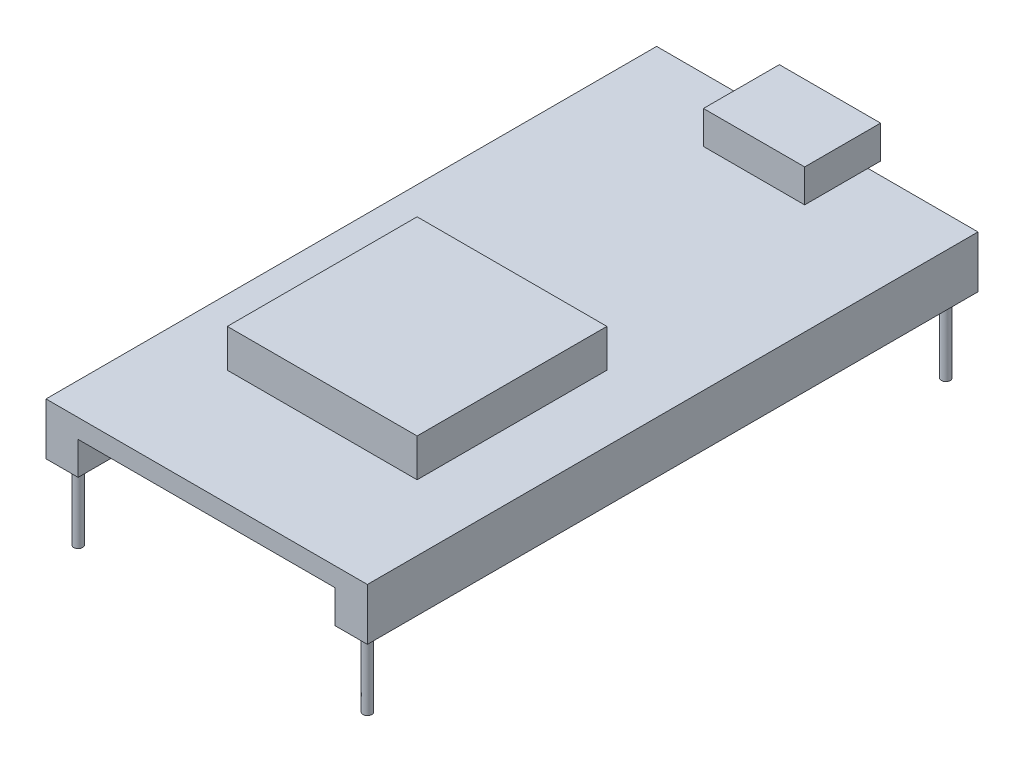
ISO-10303-21;
HEADER;
FILE_DESCRIPTION(('STEP AP214'),'2;1');
FILE_NAME('part.step','',(''),(''),'','','');
FILE_SCHEMA(('AUTOMOTIVE_DESIGN { 1 0 10303 214 1 1 1 1 }'));
ENDSEC;
DATA;
#1=APPLICATION_CONTEXT('core data for automotive mechanical design processes');
#2=APPLICATION_PROTOCOL_DEFINITION('international standard','automotive_design',2000,#1);
#3=PRODUCT_CONTEXT('',#1,'mechanical');
#4=PRODUCT('Part','Part','',(#3));
#5=PRODUCT_RELATED_PRODUCT_CATEGORY('part','',(#4));
#6=PRODUCT_DEFINITION_FORMATION('','',#4);
#7=PRODUCT_DEFINITION_CONTEXT('part definition',#1,'design');
#8=PRODUCT_DEFINITION('design','',#6,#7);
#9=PRODUCT_DEFINITION_SHAPE('','',#8);
#10=(LENGTH_UNIT() NAMED_UNIT(*) SI_UNIT(.MILLI.,.METRE.));
#11=(NAMED_UNIT(*) PLANE_ANGLE_UNIT() SI_UNIT($,.RADIAN.));
#12=(NAMED_UNIT(*) SI_UNIT($,.STERADIAN.) SOLID_ANGLE_UNIT());
#13=UNCERTAINTY_MEASURE_WITH_UNIT(LENGTH_MEASURE(1.E-05),#10,'distance_accuracy_value','');
#14=(GEOMETRIC_REPRESENTATION_CONTEXT(3) GLOBAL_UNCERTAINTY_ASSIGNED_CONTEXT((#13)) GLOBAL_UNIT_ASSIGNED_CONTEXT((#10,
#11,#12)) REPRESENTATION_CONTEXT('',''));
#15=CARTESIAN_POINT('',(0.,0.,0.));
#16=DIRECTION('',(0.,0.,1.));
#17=DIRECTION('',(1.,0.,0.));
#18=AXIS2_PLACEMENT_3D('',#15,#16,#17);
#19=CARTESIAN_POINT('',(0.,0.,0.));
#20=DIRECTION('',(0.,-1.,0.));
#21=DIRECTION('',(0.,0.,-1.));
#22=AXIS2_PLACEMENT_3D('',#19,#20,#21);
#23=PLANE('',#22);
#24=DIRECTION('',(-1.,0.,0.));
#25=VECTOR('',#24,1.);
#26=CARTESIAN_POINT('',(-12.7,0.,-24.13));
#27=LINE('',#26,#25);
#28=CARTESIAN_POINT('',(10.16,0.,-24.13));
#29=VERTEX_POINT('',#28);
#30=CARTESIAN_POINT('',(-10.16,0.,-24.13));
#31=VERTEX_POINT('',#30);
#32=EDGE_CURVE('E53',#29,#31,#27,.T.);
#33=ORIENTED_EDGE('',*,*,#32,.F.);
#34=DIRECTION('',(0.,0.,-1.));
#35=VECTOR('',#34,1.);
#36=CARTESIAN_POINT('',(10.16,0.,24.13));
#37=LINE('',#36,#35);
#38=CARTESIAN_POINT('',(10.16,0.,24.13));
#39=VERTEX_POINT('',#38);
#40=EDGE_CURVE('E178',#39,#29,#37,.T.);
#41=ORIENTED_EDGE('',*,*,#40,.F.);
#42=DIRECTION('',(1.,0.,0.));
#43=VECTOR('',#42,1.);
#44=CARTESIAN_POINT('',(-12.7,0.,24.13));
#45=LINE('',#44,#43);
#46=CARTESIAN_POINT('',(-10.16,0.,24.13));
#47=VERTEX_POINT('',#46);
#48=EDGE_CURVE('E277',#47,#39,#45,.T.);
#49=ORIENTED_EDGE('',*,*,#48,.F.);
#50=DIRECTION('',(0.,0.,1.));
#51=VECTOR('',#50,1.);
#52=CARTESIAN_POINT('',(-10.16,0.,-24.13));
#53=LINE('',#52,#51);
#54=EDGE_CURVE('E189',#31,#47,#53,.T.);
#55=ORIENTED_EDGE('',*,*,#54,.F.);
#56=EDGE_LOOP('',(#33,#41,#49,#55));
#57=FACE_BOUND('',#56,.T.);
#58=ADVANCED_FACE('F33',(#57),#23,.T.);
#59=CARTESIAN_POINT('',(0.,1.5,0.));
#60=DIRECTION('',(0.,-1.,0.));
#61=DIRECTION('',(0.,0.,-1.));
#62=AXIS2_PLACEMENT_3D('',#59,#60,#61);
#63=PLANE('',#62);
#64=DIRECTION('',(0.,0.,-1.));
#65=VECTOR('',#64,1.);
#66=CARTESIAN_POINT('',(7.50000000000001,1.5,15.));
#67=LINE('',#66,#65);
#68=CARTESIAN_POINT('',(7.50000000000001,1.5,15.));
#69=VERTEX_POINT('',#68);
#70=CARTESIAN_POINT('',(7.5,1.5,0.));
#71=VERTEX_POINT('',#70);
#72=EDGE_CURVE('E242',#69,#71,#67,.T.);
#73=ORIENTED_EDGE('',*,*,#72,.F.);
#74=DIRECTION('',(1.,0.,0.));
#75=VECTOR('',#74,1.);
#76=CARTESIAN_POINT('',(-7.49999999999999,1.5,15.));
#77=LINE('',#76,#75);
#78=CARTESIAN_POINT('',(-7.49999999999999,1.5,15.));
#79=VERTEX_POINT('',#78);
#80=EDGE_CURVE('E247',#79,#69,#77,.T.);
#81=ORIENTED_EDGE('',*,*,#80,.F.);
#82=DIRECTION('',(0.,0.,1.));
#83=VECTOR('',#82,1.);
#84=CARTESIAN_POINT('',(-7.49999999999999,1.5,15.));
#85=LINE('',#84,#83);
#86=CARTESIAN_POINT('',(-7.5,1.5,0.));
#87=VERTEX_POINT('',#86);
#88=EDGE_CURVE('E259',#87,#79,#85,.T.);
#89=ORIENTED_EDGE('',*,*,#88,.F.);
#90=DIRECTION('',(-1.,0.,0.));
#91=VECTOR('',#90,1.);
#92=CARTESIAN_POINT('',(-7.5,1.5,0.));
#93=LINE('',#92,#91);
#94=EDGE_CURVE('E256',#71,#87,#93,.T.);
#95=ORIENTED_EDGE('',*,*,#94,.F.);
#96=EDGE_LOOP('',(#73,#81,#89,#95));
#97=FACE_BOUND('',#96,.T.);
#98=DIRECTION('',(0.,0.,-1.));
#99=VECTOR('',#98,1.);
#100=CARTESIAN_POINT('',(4.,1.5,-19.13));
#101=LINE('',#100,#99);
#102=CARTESIAN_POINT('',(4.,1.5,-19.13));
#103=VERTEX_POINT('',#102);
#104=CARTESIAN_POINT('',(3.99999999999999,1.5,-24.13));
#105=VERTEX_POINT('',#104);
#106=EDGE_CURVE('E220',#103,#105,#101,.T.);
#107=ORIENTED_EDGE('',*,*,#106,.F.);
#108=DIRECTION('',(1.,0.,0.));
#109=VECTOR('',#108,1.);
#110=CARTESIAN_POINT('',(-4.,1.5,-19.13));
#111=LINE('',#110,#109);
#112=CARTESIAN_POINT('',(-4.,1.5,-19.13));
#113=VERTEX_POINT('',#112);
#114=EDGE_CURVE('E213',#113,#103,#111,.T.);
#115=ORIENTED_EDGE('',*,*,#114,.F.);
#116=DIRECTION('',(0.,0.,1.));
#117=VECTOR('',#116,1.);
#118=CARTESIAN_POINT('',(-4.,1.5,-19.13));
#119=LINE('',#118,#117);
#120=CARTESIAN_POINT('',(-4.,1.5,-24.13));
#121=VERTEX_POINT('',#120);
#122=EDGE_CURVE('E225',#121,#113,#119,.T.);
#123=ORIENTED_EDGE('',*,*,#122,.F.);
#124=DIRECTION('',(-1.,0.,0.));
#125=VECTOR('',#124,1.);
#126=CARTESIAN_POINT('',(-12.7,1.5,-24.13));
#127=LINE('',#126,#125);
#128=CARTESIAN_POINT('',(-12.7,1.5,-24.13));
#129=VERTEX_POINT('',#128);
#130=EDGE_CURVE('E276',#121,#129,#127,.T.);
#131=ORIENTED_EDGE('',*,*,#130,.T.);
#132=DIRECTION('',(0.,0.,1.));
#133=VECTOR('',#132,1.);
#134=CARTESIAN_POINT('',(-12.7,1.5,24.13));
#135=LINE('',#134,#133);
#136=CARTESIAN_POINT('',(-12.7,1.5,24.13));
#137=VERTEX_POINT('',#136);
#138=EDGE_CURVE('E281',#129,#137,#135,.T.);
#139=ORIENTED_EDGE('',*,*,#138,.T.);
#140=DIRECTION('',(1.,0.,0.));
#141=VECTOR('',#140,1.);
#142=CARTESIAN_POINT('',(-12.7,1.5,24.13));
#143=LINE('',#142,#141);
#144=CARTESIAN_POINT('',(12.7,1.5,24.13));
#145=VERTEX_POINT('',#144);
#146=EDGE_CURVE('E164',#137,#145,#143,.T.);
#147=ORIENTED_EDGE('',*,*,#146,.T.);
#148=DIRECTION('',(0.,0.,-1.));
#149=VECTOR('',#148,1.);
#150=CARTESIAN_POINT('',(12.7,1.5,24.13));
#151=LINE('',#150,#149);
#152=CARTESIAN_POINT('',(12.7,1.5,-24.13));
#153=VERTEX_POINT('',#152);
#154=EDGE_CURVE('E160',#145,#153,#151,.T.);
#155=ORIENTED_EDGE('',*,*,#154,.T.);
#156=EDGE_CURVE('E278',#153,#105,#127,.T.);
#157=ORIENTED_EDGE('',*,*,#156,.T.);
#158=EDGE_LOOP('',(#107,#115,#123,#131,#139,#147,#155,#157));
#159=FACE_BOUND('',#158,.T.);
#160=ADVANCED_FACE('F323',(#97,#159),#63,.F.);
#161=CARTESIAN_POINT('',(12.7,1.5,24.13));
#162=DIRECTION('',(-1.,0.,0.));
#163=DIRECTION('',(0.,0.,1.));
#164=AXIS2_PLACEMENT_3D('',#161,#162,#163);
#165=PLANE('',#164);
#166=DIRECTION('',(0.,-1.,0.));
#167=VECTOR('',#166,1.);
#168=CARTESIAN_POINT('',(12.7,1.5,24.13));
#169=LINE('',#168,#167);
#170=CARTESIAN_POINT('',(12.7,-2.6,24.13));
#171=VERTEX_POINT('',#170);
#172=EDGE_CURVE('E154',#145,#171,#169,.T.);
#173=ORIENTED_EDGE('',*,*,#172,.T.);
#174=DIRECTION('',(0.,0.,1.));
#175=VECTOR('',#174,1.);
#176=CARTESIAN_POINT('',(12.7,-2.6,24.13));
#177=LINE('',#176,#175);
#178=CARTESIAN_POINT('',(12.7,-2.6,-24.13));
#179=VERTEX_POINT('',#178);
#180=EDGE_CURVE('E158',#179,#171,#177,.T.);
#181=ORIENTED_EDGE('',*,*,#180,.F.);
#182=DIRECTION('',(0.,-1.,0.));
#183=VECTOR('',#182,1.);
#184=CARTESIAN_POINT('',(12.7,1.5,-24.13));
#185=LINE('',#184,#183);
#186=EDGE_CURVE('E290',#153,#179,#185,.T.);
#187=ORIENTED_EDGE('',*,*,#186,.F.);
#188=ORIENTED_EDGE('',*,*,#154,.F.);
#189=EDGE_LOOP('',(#173,#181,#187,#188));
#190=FACE_BOUND('',#189,.T.);
#191=ADVANCED_FACE('F35',(#190),#165,.F.);
#192=CARTESIAN_POINT('',(-12.7,1.5,-24.13));
#193=DIRECTION('',(0.,0.,1.));
#194=DIRECTION('',(1.,0.,0.));
#195=AXIS2_PLACEMENT_3D('',#192,#193,#194);
#196=PLANE('',#195);
#197=ORIENTED_EDGE('',*,*,#186,.T.);
#198=DIRECTION('',(1.,0.,0.));
#199=VECTOR('',#198,1.);
#200=CARTESIAN_POINT('',(12.7,-2.6,-24.13));
#201=LINE('',#200,#199);
#202=CARTESIAN_POINT('',(10.16,-2.6,-24.13));
#203=VERTEX_POINT('',#202);
#204=EDGE_CURVE('E177',#203,#179,#201,.T.);
#205=ORIENTED_EDGE('',*,*,#204,.F.);
#206=DIRECTION('',(0.,1.,0.));
#207=VECTOR('',#206,1.);
#208=CARTESIAN_POINT('',(10.16,-2.6,-24.13));
#209=LINE('',#208,#207);
#210=EDGE_CURVE('E48',#203,#29,#209,.T.);
#211=ORIENTED_EDGE('',*,*,#210,.T.);
#212=ORIENTED_EDGE('',*,*,#32,.T.);
#213=DIRECTION('',(0.,1.,0.));
#214=VECTOR('',#213,1.);
#215=CARTESIAN_POINT('',(-10.16,-2.6,-24.13));
#216=LINE('',#215,#214);
#217=CARTESIAN_POINT('',(-10.16,-2.6,-24.13));
#218=VERTEX_POINT('',#217);
#219=EDGE_CURVE('E205',#218,#31,#216,.T.);
#220=ORIENTED_EDGE('',*,*,#219,.F.);
#221=DIRECTION('',(1.,0.,0.));
#222=VECTOR('',#221,1.);
#223=CARTESIAN_POINT('',(-12.7,-2.6,-24.13));
#224=LINE('',#223,#222);
#225=CARTESIAN_POINT('',(-12.7,-2.6,-24.13));
#226=VERTEX_POINT('',#225);
#227=EDGE_CURVE('E193',#226,#218,#224,.T.);
#228=ORIENTED_EDGE('',*,*,#227,.F.);
#229=DIRECTION('',(0.,-1.,0.));
#230=VECTOR('',#229,1.);
#231=CARTESIAN_POINT('',(-12.7,1.5,-24.13));
#232=LINE('',#231,#230);
#233=EDGE_CURVE('E288',#129,#226,#232,.T.);
#234=ORIENTED_EDGE('',*,*,#233,.F.);
#235=ORIENTED_EDGE('',*,*,#130,.F.);
#236=EDGE_CURVE('E282',#105,#121,#127,.T.);
#237=ORIENTED_EDGE('',*,*,#236,.F.);
#238=ORIENTED_EDGE('',*,*,#156,.F.);
#239=EDGE_LOOP('',(#197,#205,#211,#212,#220,#228,#234,#235,#237,#238));
#240=FACE_BOUND('',#239,.T.);
#241=ADVANCED_FACE('F318',(#240),#196,.F.);
#242=CARTESIAN_POINT('',(-12.7,1.5,24.13));
#243=DIRECTION('',(1.,0.,0.));
#244=DIRECTION('',(0.,0.,-1.));
#245=AXIS2_PLACEMENT_3D('',#242,#243,#244);
#246=PLANE('',#245);
#247=ORIENTED_EDGE('',*,*,#233,.T.);
#248=DIRECTION('',(0.,0.,-1.));
#249=VECTOR('',#248,1.);
#250=CARTESIAN_POINT('',(-12.7,-2.6,-24.13));
#251=LINE('',#250,#249);
#252=CARTESIAN_POINT('',(-12.7,-2.6,24.13));
#253=VERTEX_POINT('',#252);
#254=EDGE_CURVE('E190',#253,#226,#251,.T.);
#255=ORIENTED_EDGE('',*,*,#254,.F.);
#256=DIRECTION('',(0.,-1.,0.));
#257=VECTOR('',#256,1.);
#258=CARTESIAN_POINT('',(-12.7,1.5,24.13));
#259=LINE('',#258,#257);
#260=EDGE_CURVE('E163',#137,#253,#259,.T.);
#261=ORIENTED_EDGE('',*,*,#260,.F.);
#262=ORIENTED_EDGE('',*,*,#138,.F.);
#263=EDGE_LOOP('',(#247,#255,#261,#262));
#264=FACE_BOUND('',#263,.T.);
#265=ADVANCED_FACE('F315',(#264),#246,.F.);
#266=CARTESIAN_POINT('',(-12.7,1.5,24.13));
#267=DIRECTION('',(0.,0.,-1.));
#268=DIRECTION('',(-1.,0.,0.));
#269=AXIS2_PLACEMENT_3D('',#266,#267,#268);
#270=PLANE('',#269);
#271=ORIENTED_EDGE('',*,*,#260,.T.);
#272=DIRECTION('',(-1.,0.,0.));
#273=VECTOR('',#272,1.);
#274=CARTESIAN_POINT('',(-12.7,-2.6,24.13));
#275=LINE('',#274,#273);
#276=CARTESIAN_POINT('',(-10.16,-2.6,24.13));
#277=VERTEX_POINT('',#276);
#278=EDGE_CURVE('E197',#277,#253,#275,.T.);
#279=ORIENTED_EDGE('',*,*,#278,.F.);
#280=DIRECTION('',(0.,1.,0.));
#281=VECTOR('',#280,1.);
#282=CARTESIAN_POINT('',(-10.16,-2.6,24.13));
#283=LINE('',#282,#281);
#284=EDGE_CURVE('E200',#277,#47,#283,.T.);
#285=ORIENTED_EDGE('',*,*,#284,.T.);
#286=ORIENTED_EDGE('',*,*,#48,.T.);
#287=DIRECTION('',(0.,1.,0.));
#288=VECTOR('',#287,1.);
#289=CARTESIAN_POINT('',(10.16,-2.6,24.13));
#290=LINE('',#289,#288);
#291=CARTESIAN_POINT('',(10.16,-2.6,24.13));
#292=VERTEX_POINT('',#291);
#293=EDGE_CURVE('E170',#292,#39,#290,.T.);
#294=ORIENTED_EDGE('',*,*,#293,.F.);
#295=DIRECTION('',(-1.,0.,0.));
#296=VECTOR('',#295,1.);
#297=CARTESIAN_POINT('',(12.7,-2.6,24.13));
#298=LINE('',#297,#296);
#299=EDGE_CURVE('E167',#171,#292,#298,.T.);
#300=ORIENTED_EDGE('',*,*,#299,.F.);
#301=ORIENTED_EDGE('',*,*,#172,.F.);
#302=ORIENTED_EDGE('',*,*,#146,.F.);
#303=EDGE_LOOP('',(#271,#279,#285,#286,#294,#300,#301,#302));
#304=FACE_BOUND('',#303,.T.);
#305=ADVANCED_FACE('F168',(#304),#270,.F.);
#306=CARTESIAN_POINT('',(7.50000000000001,4.5,15.));
#307=DIRECTION('',(-1.,0.,0.));
#308=DIRECTION('',(0.,0.,1.));
#309=AXIS2_PLACEMENT_3D('',#306,#307,#308);
#310=PLANE('',#309);
#311=ORIENTED_EDGE('',*,*,#72,.T.);
#312=DIRECTION('',(0.,-1.,0.));
#313=VECTOR('',#312,1.);
#314=CARTESIAN_POINT('',(7.5,4.5,0.));
#315=LINE('',#314,#313);
#316=CARTESIAN_POINT('',(7.5,4.5,0.));
#317=VERTEX_POINT('',#316);
#318=EDGE_CURVE('E272',#317,#71,#315,.T.);
#319=ORIENTED_EDGE('',*,*,#318,.F.);
#320=DIRECTION('',(0.,0.,-1.));
#321=VECTOR('',#320,1.);
#322=CARTESIAN_POINT('',(7.50000000000001,4.5,15.));
#323=LINE('',#322,#321);
#324=CARTESIAN_POINT('',(7.50000000000001,4.5,15.));
#325=VERTEX_POINT('',#324);
#326=EDGE_CURVE('E243',#325,#317,#323,.T.);
#327=ORIENTED_EDGE('',*,*,#326,.F.);
#328=DIRECTION('',(0.,-1.,0.));
#329=VECTOR('',#328,1.);
#330=CARTESIAN_POINT('',(7.50000000000001,4.5,15.));
#331=LINE('',#330,#329);
#332=EDGE_CURVE('E253',#325,#69,#331,.T.);
#333=ORIENTED_EDGE('',*,*,#332,.T.);
#334=EDGE_LOOP('',(#311,#319,#327,#333));
#335=FACE_BOUND('',#334,.T.);
#336=ADVANCED_FACE('F370',(#335),#310,.F.);
#337=CARTESIAN_POINT('',(-7.5,4.5,0.));
#338=DIRECTION('',(0.,0.,1.));
#339=DIRECTION('',(1.,0.,0.));
#340=AXIS2_PLACEMENT_3D('',#337,#338,#339);
#341=PLANE('',#340);
#342=ORIENTED_EDGE('',*,*,#94,.T.);
#343=DIRECTION('',(0.,-1.,0.));
#344=VECTOR('',#343,1.);
#345=CARTESIAN_POINT('',(-7.5,4.5,0.));
#346=LINE('',#345,#344);
#347=CARTESIAN_POINT('',(-7.5,4.5,0.));
#348=VERTEX_POINT('',#347);
#349=EDGE_CURVE('E269',#348,#87,#346,.T.);
#350=ORIENTED_EDGE('',*,*,#349,.F.);
#351=DIRECTION('',(-1.,0.,0.));
#352=VECTOR('',#351,1.);
#353=CARTESIAN_POINT('',(-7.5,4.5,0.));
#354=LINE('',#353,#352);
#355=EDGE_CURVE('E246',#317,#348,#354,.T.);
#356=ORIENTED_EDGE('',*,*,#355,.F.);
#357=ORIENTED_EDGE('',*,*,#318,.T.);
#358=EDGE_LOOP('',(#342,#350,#356,#357));
#359=FACE_BOUND('',#358,.T.);
#360=ADVANCED_FACE('F607',(#359),#341,.F.);
#361=CARTESIAN_POINT('',(-7.49999999999999,4.5,15.));
#362=DIRECTION('',(1.,0.,0.));
#363=DIRECTION('',(0.,0.,-1.));
#364=AXIS2_PLACEMENT_3D('',#361,#362,#363);
#365=PLANE('',#364);
#366=ORIENTED_EDGE('',*,*,#88,.T.);
#367=DIRECTION('',(0.,-1.,0.));
#368=VECTOR('',#367,1.);
#369=CARTESIAN_POINT('',(-7.49999999999999,4.5,15.));
#370=LINE('',#369,#368);
#371=CARTESIAN_POINT('',(-7.49999999999999,4.5,15.));
#372=VERTEX_POINT('',#371);
#373=EDGE_CURVE('E266',#372,#79,#370,.T.);
#374=ORIENTED_EDGE('',*,*,#373,.F.);
#375=DIRECTION('',(0.,0.,1.));
#376=VECTOR('',#375,1.);
#377=CARTESIAN_POINT('',(-7.49999999999999,4.5,15.));
#378=LINE('',#377,#376);
#379=EDGE_CURVE('E249',#348,#372,#378,.T.);
#380=ORIENTED_EDGE('',*,*,#379,.F.);
#381=ORIENTED_EDGE('',*,*,#349,.T.);
#382=EDGE_LOOP('',(#366,#374,#380,#381));
#383=FACE_BOUND('',#382,.T.);
#384=ADVANCED_FACE('F613',(#383),#365,.F.);
#385=CARTESIAN_POINT('',(-7.49999999999999,4.5,15.));
#386=DIRECTION('',(0.,0.,-1.));
#387=DIRECTION('',(-1.,0.,0.));
#388=AXIS2_PLACEMENT_3D('',#385,#386,#387);
#389=PLANE('',#388);
#390=ORIENTED_EDGE('',*,*,#80,.T.);
#391=ORIENTED_EDGE('',*,*,#332,.F.);
#392=DIRECTION('',(1.,0.,0.));
#393=VECTOR('',#392,1.);
#394=CARTESIAN_POINT('',(-7.49999999999999,4.5,15.));
#395=LINE('',#394,#393);
#396=EDGE_CURVE('E251',#372,#325,#395,.T.);
#397=ORIENTED_EDGE('',*,*,#396,.F.);
#398=ORIENTED_EDGE('',*,*,#373,.T.);
#399=EDGE_LOOP('',(#390,#391,#397,#398));
#400=FACE_BOUND('',#399,.T.);
#401=ADVANCED_FACE('F621',(#400),#389,.F.);
#402=CARTESIAN_POINT('',(0.,4.5,0.));
#403=DIRECTION('',(0.,-1.,0.));
#404=DIRECTION('',(0.,0.,-1.));
#405=AXIS2_PLACEMENT_3D('',#402,#403,#404);
#406=PLANE('',#405);
#407=ORIENTED_EDGE('',*,*,#326,.T.);
#408=ORIENTED_EDGE('',*,*,#355,.T.);
#409=ORIENTED_EDGE('',*,*,#379,.T.);
#410=ORIENTED_EDGE('',*,*,#396,.T.);
#411=EDGE_LOOP('',(#407,#408,#409,#410));
#412=FACE_BOUND('',#411,.T.);
#413=ADVANCED_FACE('F390',(#412),#406,.F.);
#414=CARTESIAN_POINT('',(0.,1.5,0.));
#415=DIRECTION('',(0.,-1.,0.));
#416=DIRECTION('',(0.,0.,-1.));
#417=AXIS2_PLACEMENT_3D('',#414,#415,#416);
#418=PLANE('',#417);
#419=ORIENTED_EDGE('',*,*,#236,.T.);
#420=CARTESIAN_POINT('',(-4.,1.5,-25.13));
#421=VERTEX_POINT('',#420);
#422=EDGE_CURVE('E226',#421,#121,#119,.T.);
#423=ORIENTED_EDGE('',*,*,#422,.F.);
#424=DIRECTION('',(-1.,0.,0.));
#425=VECTOR('',#424,1.);
#426=CARTESIAN_POINT('',(-4.,1.5,-25.13));
#427=LINE('',#426,#425);
#428=CARTESIAN_POINT('',(4.,1.5,-25.13));
#429=VERTEX_POINT('',#428);
#430=EDGE_CURVE('E223',#429,#421,#427,.T.);
#431=ORIENTED_EDGE('',*,*,#430,.F.);
#432=EDGE_CURVE('E208',#105,#429,#101,.T.);
#433=ORIENTED_EDGE('',*,*,#432,.F.);
#434=EDGE_LOOP('',(#419,#423,#431,#433));
#435=FACE_BOUND('',#434,.T.);
#436=ADVANCED_FACE('F330',(#435),#418,.T.);
#437=CARTESIAN_POINT('',(4.,4.1,-19.13));
#438=DIRECTION('',(-1.,0.,0.));
#439=DIRECTION('',(0.,0.,1.));
#440=AXIS2_PLACEMENT_3D('',#437,#438,#439);
#441=PLANE('',#440);
#442=ORIENTED_EDGE('',*,*,#106,.T.);
#443=ORIENTED_EDGE('',*,*,#432,.T.);
#444=DIRECTION('',(0.,-1.,0.));
#445=VECTOR('',#444,1.);
#446=CARTESIAN_POINT('',(4.,4.1,-25.13));
#447=LINE('',#446,#445);
#448=CARTESIAN_POINT('',(4.,4.1,-25.13));
#449=VERTEX_POINT('',#448);
#450=EDGE_CURVE('E239',#449,#429,#447,.T.);
#451=ORIENTED_EDGE('',*,*,#450,.F.);
#452=DIRECTION('',(0.,0.,-1.));
#453=VECTOR('',#452,1.);
#454=CARTESIAN_POINT('',(4.,4.1,-19.13));
#455=LINE('',#454,#453);
#456=CARTESIAN_POINT('',(4.,4.1,-19.13));
#457=VERTEX_POINT('',#456);
#458=EDGE_CURVE('E209',#457,#449,#455,.T.);
#459=ORIENTED_EDGE('',*,*,#458,.F.);
#460=DIRECTION('',(0.,-1.,0.));
#461=VECTOR('',#460,1.);
#462=CARTESIAN_POINT('',(4.,4.1,-19.13));
#463=LINE('',#462,#461);
#464=EDGE_CURVE('E219',#457,#103,#463,.T.);
#465=ORIENTED_EDGE('',*,*,#464,.T.);
#466=EDGE_LOOP('',(#442,#443,#451,#459,#465));
#467=FACE_BOUND('',#466,.T.);
#468=ADVANCED_FACE('F342',(#467),#441,.F.);
#469=CARTESIAN_POINT('',(-4.,4.1,-25.13));
#470=DIRECTION('',(0.,0.,1.));
#471=DIRECTION('',(1.,0.,0.));
#472=AXIS2_PLACEMENT_3D('',#469,#470,#471);
#473=PLANE('',#472);
#474=ORIENTED_EDGE('',*,*,#430,.T.);
#475=DIRECTION('',(0.,-1.,0.));
#476=VECTOR('',#475,1.);
#477=CARTESIAN_POINT('',(-4.,4.1,-25.13));
#478=LINE('',#477,#476);
#479=CARTESIAN_POINT('',(-4.,4.1,-25.13));
#480=VERTEX_POINT('',#479);
#481=EDGE_CURVE('E236',#480,#421,#478,.T.);
#482=ORIENTED_EDGE('',*,*,#481,.F.);
#483=DIRECTION('',(-1.,0.,0.));
#484=VECTOR('',#483,1.);
#485=CARTESIAN_POINT('',(-4.,4.1,-25.13));
#486=LINE('',#485,#484);
#487=EDGE_CURVE('E212',#449,#480,#486,.T.);
#488=ORIENTED_EDGE('',*,*,#487,.F.);
#489=ORIENTED_EDGE('',*,*,#450,.T.);
#490=EDGE_LOOP('',(#474,#482,#488,#489));
#491=FACE_BOUND('',#490,.T.);
#492=ADVANCED_FACE('F338',(#491),#473,.F.);
#493=CARTESIAN_POINT('',(-4.,4.1,-19.13));
#494=DIRECTION('',(1.,0.,0.));
#495=DIRECTION('',(0.,0.,-1.));
#496=AXIS2_PLACEMENT_3D('',#493,#494,#495);
#497=PLANE('',#496);
#498=ORIENTED_EDGE('',*,*,#422,.T.);
#499=ORIENTED_EDGE('',*,*,#122,.T.);
#500=DIRECTION('',(0.,-1.,0.));
#501=VECTOR('',#500,1.);
#502=CARTESIAN_POINT('',(-4.,4.1,-19.13));
#503=LINE('',#502,#501);
#504=CARTESIAN_POINT('',(-4.,4.1,-19.13));
#505=VERTEX_POINT('',#504);
#506=EDGE_CURVE('E233',#505,#113,#503,.T.);
#507=ORIENTED_EDGE('',*,*,#506,.F.);
#508=DIRECTION('',(0.,0.,1.));
#509=VECTOR('',#508,1.);
#510=CARTESIAN_POINT('',(-4.,4.1,-19.13));
#511=LINE('',#510,#509);
#512=EDGE_CURVE('E215',#480,#505,#511,.T.);
#513=ORIENTED_EDGE('',*,*,#512,.F.);
#514=ORIENTED_EDGE('',*,*,#481,.T.);
#515=EDGE_LOOP('',(#498,#499,#507,#513,#514));
#516=FACE_BOUND('',#515,.T.);
#517=ADVANCED_FACE('F333',(#516),#497,.F.);
#518=CARTESIAN_POINT('',(-4.,4.1,-19.13));
#519=DIRECTION('',(0.,0.,-1.));
#520=DIRECTION('',(-1.,0.,0.));
#521=AXIS2_PLACEMENT_3D('',#518,#519,#520);
#522=PLANE('',#521);
#523=ORIENTED_EDGE('',*,*,#114,.T.);
#524=ORIENTED_EDGE('',*,*,#464,.F.);
#525=DIRECTION('',(1.,0.,0.));
#526=VECTOR('',#525,1.);
#527=CARTESIAN_POINT('',(-4.,4.1,-19.13));
#528=LINE('',#527,#526);
#529=EDGE_CURVE('E217',#505,#457,#528,.T.);
#530=ORIENTED_EDGE('',*,*,#529,.F.);
#531=ORIENTED_EDGE('',*,*,#506,.T.);
#532=EDGE_LOOP('',(#523,#524,#530,#531));
#533=FACE_BOUND('',#532,.T.);
#534=ADVANCED_FACE('F345',(#533),#522,.F.);
#535=CARTESIAN_POINT('',(0.,4.1,0.));
#536=DIRECTION('',(0.,-1.,0.));
#537=DIRECTION('',(0.,0.,-1.));
#538=AXIS2_PLACEMENT_3D('',#535,#536,#537);
#539=PLANE('',#538);
#540=ORIENTED_EDGE('',*,*,#458,.T.);
#541=ORIENTED_EDGE('',*,*,#487,.T.);
#542=ORIENTED_EDGE('',*,*,#512,.T.);
#543=ORIENTED_EDGE('',*,*,#529,.T.);
#544=EDGE_LOOP('',(#540,#541,#542,#543));
#545=FACE_BOUND('',#544,.T.);
#546=ADVANCED_FACE('F348',(#545),#539,.F.);
#547=CARTESIAN_POINT('',(-10.16,-2.6,-24.13));
#548=DIRECTION('',(-1.,0.,0.));
#549=DIRECTION('',(0.,0.,1.));
#550=AXIS2_PLACEMENT_3D('',#547,#548,#549);
#551=PLANE('',#550);
#552=ORIENTED_EDGE('',*,*,#54,.T.);
#553=ORIENTED_EDGE('',*,*,#284,.F.);
#554=DIRECTION('',(0.,0.,1.));
#555=VECTOR('',#554,1.);
#556=CARTESIAN_POINT('',(-10.16,-2.6,-24.13));
#557=LINE('',#556,#555);
#558=EDGE_CURVE('E195',#218,#277,#557,.T.);
#559=ORIENTED_EDGE('',*,*,#558,.F.);
#560=ORIENTED_EDGE('',*,*,#219,.T.);
#561=EDGE_LOOP('',(#552,#553,#559,#560));
#562=FACE_BOUND('',#561,.T.);
#563=ADVANCED_FACE('F306',(#562),#551,.F.);
#564=CARTESIAN_POINT('',(0.,-2.6,0.));
#565=DIRECTION('',(0.,1.,0.));
#566=DIRECTION('',(0.,0.,1.));
#567=AXIS2_PLACEMENT_3D('',#564,#565,#566);
#568=PLANE('',#567);
#569=CARTESIAN_POINT('',(-11.4300000000002,-2.6,22.8599999999998));
#570=DIRECTION('',(0.,1.,0.));
#571=DIRECTION('',(0.,0.,1.));
#572=AXIS2_PLACEMENT_3D('',#569,#570,#571);
#573=CIRCLE('',#572,0.349999999999999);
#574=CARTESIAN_POINT('',(-11.4300000000002,-2.6,23.2099999999998));
#575=VERTEX_POINT('',#574);
#576=EDGE_CURVE('E41',#575,#575,#573,.F.);
#577=ORIENTED_EDGE('',*,*,#576,.F.);
#578=EDGE_LOOP('',(#577));
#579=FACE_BOUND('',#578,.T.);
#580=CARTESIAN_POINT('',(-11.43,-2.6,-22.8600000000002));
#581=DIRECTION('',(0.,1.,0.));
#582=DIRECTION('',(0.,0.,1.));
#583=AXIS2_PLACEMENT_3D('',#580,#581,#582);
#584=CIRCLE('',#583,0.349999999999999);
#585=CARTESIAN_POINT('',(-11.43,-2.6,-22.5100000000002));
#586=VERTEX_POINT('',#585);
#587=EDGE_CURVE('E295',#586,#586,#584,.F.);
#588=ORIENTED_EDGE('',*,*,#587,.F.);
#589=EDGE_LOOP('',(#588));
#590=FACE_BOUND('',#589,.T.);
#591=ORIENTED_EDGE('',*,*,#254,.T.);
#592=ORIENTED_EDGE('',*,*,#227,.T.);
#593=ORIENTED_EDGE('',*,*,#558,.T.);
#594=ORIENTED_EDGE('',*,*,#278,.T.);
#595=EDGE_LOOP('',(#591,#592,#593,#594));
#596=FACE_BOUND('',#595,.T.);
#597=ADVANCED_FACE('F302',(#579,#590,#596),#568,.F.);
#598=CARTESIAN_POINT('',(10.16,-2.6,24.13));
#599=DIRECTION('',(1.,0.,0.));
#600=DIRECTION('',(0.,0.,-1.));
#601=AXIS2_PLACEMENT_3D('',#598,#599,#600);
#602=PLANE('',#601);
#603=ORIENTED_EDGE('',*,*,#40,.T.);
#604=ORIENTED_EDGE('',*,*,#210,.F.);
#605=DIRECTION('',(0.,0.,-1.));
#606=VECTOR('',#605,1.);
#607=CARTESIAN_POINT('',(10.16,-2.6,24.13));
#608=LINE('',#607,#606);
#609=EDGE_CURVE('E173',#292,#203,#608,.T.);
#610=ORIENTED_EDGE('',*,*,#609,.F.);
#611=ORIENTED_EDGE('',*,*,#293,.T.);
#612=EDGE_LOOP('',(#603,#604,#610,#611));
#613=FACE_BOUND('',#612,.T.);
#614=ADVANCED_FACE('F305',(#613),#602,.F.);
#615=CARTESIAN_POINT('',(0.,-2.6,0.));
#616=DIRECTION('',(0.,1.,0.));
#617=DIRECTION('',(0.,0.,1.));
#618=AXIS2_PLACEMENT_3D('',#615,#616,#617);
#619=PLANE('',#618);
#620=CARTESIAN_POINT('',(11.4299999999998,-2.6,22.86));
#621=DIRECTION('',(0.,1.,0.));
#622=DIRECTION('',(0.,0.,1.));
#623=AXIS2_PLACEMENT_3D('',#620,#621,#622);
#624=CIRCLE('',#623,0.349999999999999);
#625=CARTESIAN_POINT('',(11.4299999999998,-2.6,23.21));
#626=VERTEX_POINT('',#625);
#627=EDGE_CURVE('E11',#626,#626,#624,.F.);
#628=ORIENTED_EDGE('',*,*,#627,.F.);
#629=EDGE_LOOP('',(#628));
#630=FACE_BOUND('',#629,.T.);
#631=CARTESIAN_POINT('',(11.4300000000002,-2.6,-22.8599999999999));
#632=DIRECTION('',(0.,1.,0.));
#633=DIRECTION('',(0.,0.,1.));
#634=AXIS2_PLACEMENT_3D('',#631,#632,#633);
#635=CIRCLE('',#634,0.349999999999825);
#636=CARTESIAN_POINT('',(11.4300000000002,-2.6,-22.5100000000001));
#637=VERTEX_POINT('',#636);
#638=EDGE_CURVE('E292',#637,#637,#635,.F.);
#639=ORIENTED_EDGE('',*,*,#638,.F.);
#640=EDGE_LOOP('',(#639));
#641=FACE_BOUND('',#640,.T.);
#642=ORIENTED_EDGE('',*,*,#180,.T.);
#643=ORIENTED_EDGE('',*,*,#299,.T.);
#644=ORIENTED_EDGE('',*,*,#609,.T.);
#645=ORIENTED_EDGE('',*,*,#204,.T.);
#646=EDGE_LOOP('',(#642,#643,#644,#645));
#647=FACE_BOUND('',#646,.T.);
#648=ADVANCED_FACE('F176',(#630,#641,#647),#619,.F.);
#649=CARTESIAN_POINT('',(11.4300000000002,-8.5,-22.8599999999999));
#650=DIRECTION('',(0.,1.,0.));
#651=DIRECTION('',(0.,0.,1.));
#652=AXIS2_PLACEMENT_3D('',#649,#650,#651);
#653=CYLINDRICAL_SURFACE('',#652,0.349999999999825);
#654=CARTESIAN_POINT('',(11.4300000000002,-8.5,-22.8599999999999));
#655=DIRECTION('',(0.,-1.,0.));
#656=DIRECTION('',(0.,0.,-1.));
#657=AXIS2_PLACEMENT_3D('',#654,#655,#656);
#658=CIRCLE('',#657,0.349999999999825);
#659=CARTESIAN_POINT('',(11.4300000000002,-8.5,-23.2099999999997));
#660=VERTEX_POINT('',#659);
#661=EDGE_CURVE('E180',#660,#660,#658,.T.);
#662=ORIENTED_EDGE('',*,*,#661,.F.);
#663=EDGE_LOOP('',(#662));
#664=FACE_BOUND('',#663,.T.);
#665=ORIENTED_EDGE('',*,*,#638,.T.);
#666=EDGE_LOOP('',(#665));
#667=FACE_BOUND('',#666,.T.);
#668=ADVANCED_FACE('F496',(#664,#667),#653,.T.);
#669=CARTESIAN_POINT('',(11.4300000000002,-8.5,-22.8599999999999));
#670=DIRECTION('',(0.,-1.,0.));
#671=DIRECTION('',(0.,0.,-1.));
#672=AXIS2_PLACEMENT_3D('',#669,#670,#671);
#673=PLANE('',#672);
#674=ORIENTED_EDGE('',*,*,#661,.T.);
#675=EDGE_LOOP('',(#674));
#676=FACE_BOUND('',#675,.T.);
#677=ADVANCED_FACE('F505',(#676),#673,.T.);
#678=CARTESIAN_POINT('',(-11.43,-8.5,-22.8600000000002));
#679=DIRECTION('',(0.,1.,0.));
#680=DIRECTION('',(0.,0.,1.));
#681=AXIS2_PLACEMENT_3D('',#678,#679,#680);
#682=CYLINDRICAL_SURFACE('',#681,0.349999999999999);
#683=CARTESIAN_POINT('',(-11.43,-8.5,-22.8600000000002));
#684=DIRECTION('',(0.,-1.,0.));
#685=DIRECTION('',(0.,0.,-1.));
#686=AXIS2_PLACEMENT_3D('',#683,#684,#685);
#687=CIRCLE('',#686,0.349999999999999);
#688=CARTESIAN_POINT('',(-11.43,-8.5,-23.2100000000002));
#689=VERTEX_POINT('',#688);
#690=EDGE_CURVE('E587',#689,#689,#687,.T.);
#691=ORIENTED_EDGE('',*,*,#690,.F.);
#692=EDGE_LOOP('',(#691));
#693=FACE_BOUND('',#692,.T.);
#694=ORIENTED_EDGE('',*,*,#587,.T.);
#695=EDGE_LOOP('',(#694));
#696=FACE_BOUND('',#695,.T.);
#697=ADVANCED_FACE('F514',(#693,#696),#682,.T.);
#698=CARTESIAN_POINT('',(-11.43,-8.5,-22.8600000000002));
#699=DIRECTION('',(0.,-1.,0.));
#700=DIRECTION('',(0.,0.,-1.));
#701=AXIS2_PLACEMENT_3D('',#698,#699,#700);
#702=PLANE('',#701);
#703=ORIENTED_EDGE('',*,*,#690,.T.);
#704=EDGE_LOOP('',(#703));
#705=FACE_BOUND('',#704,.T.);
#706=ADVANCED_FACE('F523',(#705),#702,.T.);
#707=CARTESIAN_POINT('',(-11.4300000000002,-8.5,22.8599999999998));
#708=DIRECTION('',(0.,1.,0.));
#709=DIRECTION('',(0.,0.,1.));
#710=AXIS2_PLACEMENT_3D('',#707,#708,#709);
#711=CYLINDRICAL_SURFACE('',#710,0.349999999999999);
#712=CARTESIAN_POINT('',(-11.4300000000002,-8.5,22.8599999999998));
#713=DIRECTION('',(0.,-1.,0.));
#714=DIRECTION('',(0.,0.,-1.));
#715=AXIS2_PLACEMENT_3D('',#712,#713,#714);
#716=CIRCLE('',#715,0.349999999999999);
#717=CARTESIAN_POINT('',(-11.4300000000002,-8.5,22.5099999999998));
#718=VERTEX_POINT('',#717);
#719=EDGE_CURVE('E584',#718,#718,#716,.T.);
#720=ORIENTED_EDGE('',*,*,#719,.F.);
#721=EDGE_LOOP('',(#720));
#722=FACE_BOUND('',#721,.T.);
#723=ORIENTED_EDGE('',*,*,#576,.T.);
#724=EDGE_LOOP('',(#723));
#725=FACE_BOUND('',#724,.T.);
#726=ADVANCED_FACE('F300',(#722,#725),#711,.T.);
#727=CARTESIAN_POINT('',(-11.4300000000002,-8.5,22.8599999999998));
#728=DIRECTION('',(0.,-1.,0.));
#729=DIRECTION('',(0.,0.,-1.));
#730=AXIS2_PLACEMENT_3D('',#727,#728,#729);
#731=PLANE('',#730);
#732=ORIENTED_EDGE('',*,*,#719,.T.);
#733=EDGE_LOOP('',(#732));
#734=FACE_BOUND('',#733,.T.);
#735=ADVANCED_FACE('F540',(#734),#731,.T.);
#736=CARTESIAN_POINT('',(11.4299999999998,-8.5,22.86));
#737=DIRECTION('',(0.,1.,0.));
#738=DIRECTION('',(0.,0.,1.));
#739=AXIS2_PLACEMENT_3D('',#736,#737,#738);
#740=CYLINDRICAL_SURFACE('',#739,0.349999999999999);
#741=CARTESIAN_POINT('',(11.4299999999998,-8.5,22.86));
#742=DIRECTION('',(0.,-1.,0.));
#743=DIRECTION('',(0.,0.,-1.));
#744=AXIS2_PLACEMENT_3D('',#741,#742,#743);
#745=CIRCLE('',#744,0.349999999999999);
#746=CARTESIAN_POINT('',(11.4299999999998,-8.5,22.51));
#747=VERTEX_POINT('',#746);
#748=EDGE_CURVE('E583',#747,#747,#745,.T.);
#749=ORIENTED_EDGE('',*,*,#748,.F.);
#750=EDGE_LOOP('',(#749));
#751=FACE_BOUND('',#750,.T.);
#752=ORIENTED_EDGE('',*,*,#627,.T.);
#753=EDGE_LOOP('',(#752));
#754=FACE_BOUND('',#753,.T.);
#755=ADVANCED_FACE('F549',(#751,#754),#740,.T.);
#756=CARTESIAN_POINT('',(11.4299999999998,-8.5,22.86));
#757=DIRECTION('',(0.,-1.,0.));
#758=DIRECTION('',(0.,0.,-1.));
#759=AXIS2_PLACEMENT_3D('',#756,#757,#758);
#760=PLANE('',#759);
#761=ORIENTED_EDGE('',*,*,#748,.T.);
#762=EDGE_LOOP('',(#761));
#763=FACE_BOUND('',#762,.T.);
#764=ADVANCED_FACE('F558',(#763),#760,.T.);
#765=CLOSED_SHELL('',(#58,#160,#191,#241,#265,#305,#336,#360,#384,#401,#413,#436,#468,#492,#517,
#534,#546,#563,#597,#614,#648,#668,#677,#697,#706,#726,#735,#755,#764));
#766=MANIFOLD_SOLID_BREP('B2',#765);
#767=ADVANCED_BREP_SHAPE_REPRESENTATION('',(#18,#766),#14);
#768=SHAPE_DEFINITION_REPRESENTATION(#9,#767);
ENDSEC;
END-ISO-10303-21;
